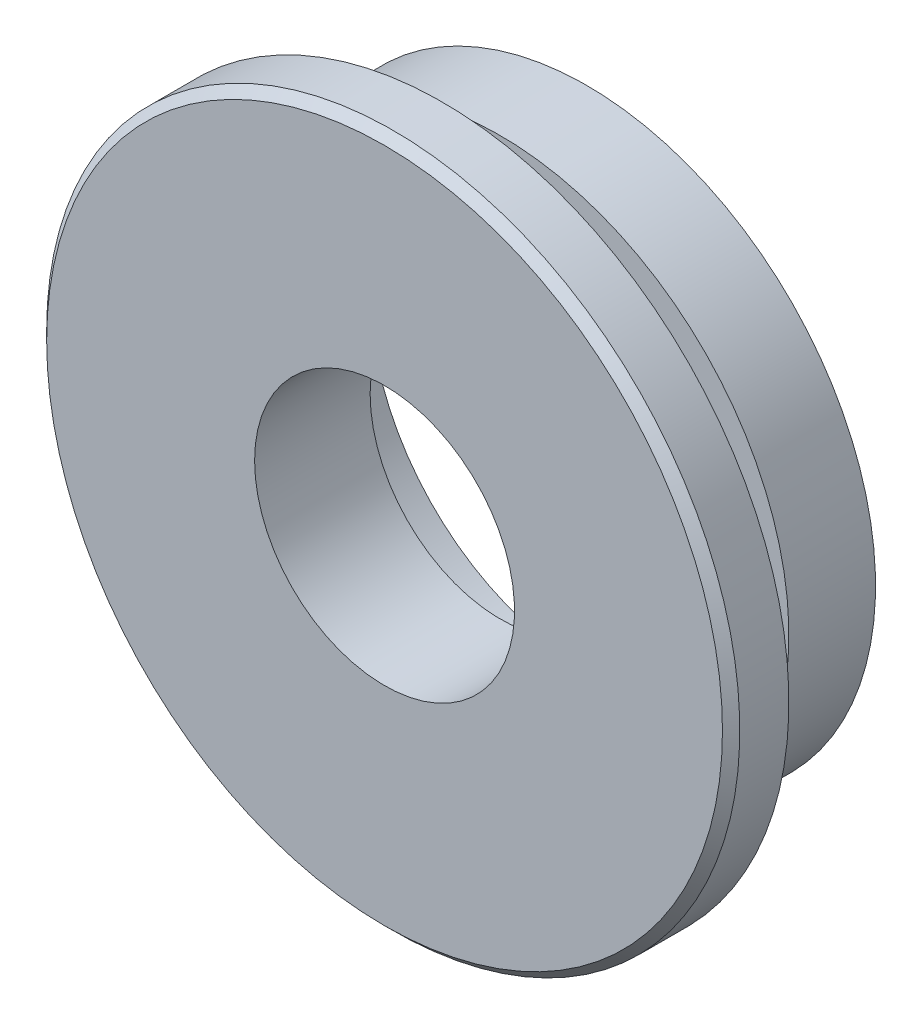
ISO-10303-21;
HEADER;
FILE_DESCRIPTION(('STEP AP214'),'2;1');
FILE_NAME('part.step','',(''),(''),'','','');
FILE_SCHEMA(('AUTOMOTIVE_DESIGN { 1 0 10303 214 1 1 1 1 }'));
ENDSEC;
DATA;
#1=APPLICATION_CONTEXT('core data for automotive mechanical design processes');
#2=APPLICATION_PROTOCOL_DEFINITION('international standard','automotive_design',2000,#1);
#3=PRODUCT_CONTEXT('',#1,'mechanical');
#4=PRODUCT('Part','Part','',(#3));
#5=PRODUCT_RELATED_PRODUCT_CATEGORY('part','',(#4));
#6=PRODUCT_DEFINITION_FORMATION('','',#4);
#7=PRODUCT_DEFINITION_CONTEXT('part definition',#1,'design');
#8=PRODUCT_DEFINITION('design','',#6,#7);
#9=PRODUCT_DEFINITION_SHAPE('','',#8);
#10=(LENGTH_UNIT() NAMED_UNIT(*) SI_UNIT(.MILLI.,.METRE.));
#11=(NAMED_UNIT(*) PLANE_ANGLE_UNIT() SI_UNIT($,.RADIAN.));
#12=(NAMED_UNIT(*) SI_UNIT($,.STERADIAN.) SOLID_ANGLE_UNIT());
#13=UNCERTAINTY_MEASURE_WITH_UNIT(LENGTH_MEASURE(1.E-05),#10,'distance_accuracy_value','');
#14=(GEOMETRIC_REPRESENTATION_CONTEXT(3) GLOBAL_UNCERTAINTY_ASSIGNED_CONTEXT((#13)) GLOBAL_UNIT_ASSIGNED_CONTEXT((#10,
#11,#12)) REPRESENTATION_CONTEXT('',''));
#15=CARTESIAN_POINT('',(0.,0.,0.));
#16=DIRECTION('',(0.,0.,1.));
#17=DIRECTION('',(1.,0.,0.));
#18=AXIS2_PLACEMENT_3D('',#15,#16,#17);
#19=CARTESIAN_POINT('',(0.,0.,-7.));
#20=DIRECTION('',(0.,0.,-1.));
#21=DIRECTION('',(-1.,0.,0.));
#22=AXIS2_PLACEMENT_3D('',#19,#20,#21);
#23=CYLINDRICAL_SURFACE('',#22,4.5);
#24=CARTESIAN_POINT('',(0.,0.,-4.));
#25=DIRECTION('',(0.,0.,-1.));
#26=DIRECTION('',(-1.,0.,0.));
#27=AXIS2_PLACEMENT_3D('',#24,#25,#26);
#28=CIRCLE('',#27,4.5);
#29=CARTESIAN_POINT('',(-4.5,0.,-4.));
#30=VERTEX_POINT('',#29);
#31=EDGE_CURVE('E10',#30,#30,#28,.T.);
#32=ORIENTED_EDGE('',*,*,#31,.T.);
#33=EDGE_LOOP('',(#32));
#34=FACE_BOUND('',#33,.T.);
#35=CARTESIAN_POINT('',(0.,0.,0.));
#36=DIRECTION('',(0.,0.,-1.));
#37=DIRECTION('',(-1.,0.,0.));
#38=AXIS2_PLACEMENT_3D('',#35,#36,#37);
#39=CIRCLE('',#38,4.5);
#40=CARTESIAN_POINT('',(-4.5,0.,0.));
#41=VERTEX_POINT('',#40);
#42=EDGE_CURVE('E68',#41,#41,#39,.T.);
#43=ORIENTED_EDGE('',*,*,#42,.F.);
#44=EDGE_LOOP('',(#43));
#45=FACE_BOUND('',#44,.T.);
#46=ADVANCED_FACE('F31',(#34,#45),#23,.F.);
#47=CARTESIAN_POINT('',(-4.5,0.,-4.));
#48=DIRECTION('',(0.,0.,-1.));
#49=DIRECTION('',(-1.,0.,0.));
#50=AXIS2_PLACEMENT_3D('',#47,#48,#49);
#51=PLANE('',#50);
#52=CARTESIAN_POINT('',(0.,0.,-4.));
#53=DIRECTION('',(0.,0.,-1.));
#54=DIRECTION('',(-1.,0.,0.));
#55=AXIS2_PLACEMENT_3D('',#52,#53,#54);
#56=CIRCLE('',#55,7.5);
#57=CARTESIAN_POINT('',(-7.5,0.,-4.));
#58=VERTEX_POINT('',#57);
#59=EDGE_CURVE('E37',#58,#58,#56,.T.);
#60=ORIENTED_EDGE('',*,*,#59,.T.);
#61=EDGE_LOOP('',(#60));
#62=FACE_BOUND('',#61,.T.);
#63=ORIENTED_EDGE('',*,*,#31,.F.);
#64=EDGE_LOOP('',(#63));
#65=FACE_BOUND('',#64,.T.);
#66=ADVANCED_FACE('F76',(#62,#65),#51,.T.);
#67=CARTESIAN_POINT('',(0.,0.,-7.));
#68=DIRECTION('',(0.,0.,-1.));
#69=DIRECTION('',(-1.,0.,0.));
#70=AXIS2_PLACEMENT_3D('',#67,#68,#69);
#71=CYLINDRICAL_SURFACE('',#70,7.5);
#72=CARTESIAN_POINT('',(0.,0.,-7.));
#73=DIRECTION('',(0.,0.,-1.));
#74=DIRECTION('',(-1.,0.,0.));
#75=AXIS2_PLACEMENT_3D('',#72,#73,#74);
#76=CIRCLE('',#75,7.5);
#77=CARTESIAN_POINT('',(-7.5,0.,-7.));
#78=VERTEX_POINT('',#77);
#79=EDGE_CURVE('E41',#78,#78,#76,.T.);
#80=ORIENTED_EDGE('',*,*,#79,.T.);
#81=EDGE_LOOP('',(#80));
#82=FACE_BOUND('',#81,.T.);
#83=ORIENTED_EDGE('',*,*,#59,.F.);
#84=EDGE_LOOP('',(#83));
#85=FACE_BOUND('',#84,.T.);
#86=ADVANCED_FACE('F80',(#82,#85),#71,.F.);
#87=CARTESIAN_POINT('',(-10.,0.,-7.));
#88=DIRECTION('',(0.,0.,-1.));
#89=DIRECTION('',(-1.,0.,0.));
#90=AXIS2_PLACEMENT_3D('',#87,#88,#89);
#91=PLANE('',#90);
#92=CARTESIAN_POINT('',(0.,0.,-7.));
#93=DIRECTION('',(0.,0.,-1.));
#94=DIRECTION('',(-1.,0.,0.));
#95=AXIS2_PLACEMENT_3D('',#92,#93,#94);
#96=CIRCLE('',#95,10.);
#97=CARTESIAN_POINT('',(-10.,0.,-7.));
#98=VERTEX_POINT('',#97);
#99=EDGE_CURVE('E45',#98,#98,#96,.T.);
#100=ORIENTED_EDGE('',*,*,#99,.T.);
#101=EDGE_LOOP('',(#100));
#102=FACE_BOUND('',#101,.T.);
#103=ORIENTED_EDGE('',*,*,#79,.F.);
#104=EDGE_LOOP('',(#103));
#105=FACE_BOUND('',#104,.T.);
#106=ADVANCED_FACE('F84',(#102,#105),#91,.T.);
#107=CARTESIAN_POINT('',(0.,0.,-7.));
#108=DIRECTION('',(0.,0.,-1.));
#109=DIRECTION('',(-1.,0.,0.));
#110=AXIS2_PLACEMENT_3D('',#107,#108,#109);
#111=CYLINDRICAL_SURFACE('',#110,10.);
#112=CARTESIAN_POINT('',(0.,0.,-4.));
#113=DIRECTION('',(0.,0.,-1.));
#114=DIRECTION('',(-1.,0.,0.));
#115=AXIS2_PLACEMENT_3D('',#112,#113,#114);
#116=CIRCLE('',#115,10.);
#117=CARTESIAN_POINT('',(-10.,0.,-4.));
#118=VERTEX_POINT('',#117);
#119=EDGE_CURVE('E50',#118,#118,#116,.T.);
#120=ORIENTED_EDGE('',*,*,#119,.T.);
#121=EDGE_LOOP('',(#120));
#122=FACE_BOUND('',#121,.T.);
#123=ORIENTED_EDGE('',*,*,#99,.F.);
#124=EDGE_LOOP('',(#123));
#125=FACE_BOUND('',#124,.T.);
#126=ADVANCED_FACE('F91',(#122,#125),#111,.T.);
#127=CARTESIAN_POINT('',(-9.,0.,-4.));
#128=DIRECTION('',(0.,0.,1.));
#129=DIRECTION('',(1.,0.,0.));
#130=AXIS2_PLACEMENT_3D('',#127,#128,#129);
#131=PLANE('',#130);
#132=CARTESIAN_POINT('',(0.,0.,-4.));
#133=DIRECTION('',(0.,0.,-1.));
#134=DIRECTION('',(-1.,0.,0.));
#135=AXIS2_PLACEMENT_3D('',#132,#133,#134);
#136=CIRCLE('',#135,9.);
#137=CARTESIAN_POINT('',(-9.,0.,-4.));
#138=VERTEX_POINT('',#137);
#139=EDGE_CURVE('E53',#138,#138,#136,.T.);
#140=ORIENTED_EDGE('',*,*,#139,.T.);
#141=EDGE_LOOP('',(#140));
#142=FACE_BOUND('',#141,.T.);
#143=ORIENTED_EDGE('',*,*,#119,.F.);
#144=EDGE_LOOP('',(#143));
#145=FACE_BOUND('',#144,.T.);
#146=ADVANCED_FACE('F95',(#142,#145),#131,.T.);
#147=CARTESIAN_POINT('',(0.,0.,-7.));
#148=DIRECTION('',(0.,0.,-1.));
#149=DIRECTION('',(-1.,0.,0.));
#150=AXIS2_PLACEMENT_3D('',#147,#148,#149);
#151=CYLINDRICAL_SURFACE('',#150,9.);
#152=CARTESIAN_POINT('',(0.,0.,-2.));
#153=DIRECTION('',(0.,0.,-1.));
#154=DIRECTION('',(-1.,0.,0.));
#155=AXIS2_PLACEMENT_3D('',#152,#153,#154);
#156=CIRCLE('',#155,9.);
#157=CARTESIAN_POINT('',(-9.,0.,-2.));
#158=VERTEX_POINT('',#157);
#159=EDGE_CURVE('E56',#158,#158,#156,.T.);
#160=ORIENTED_EDGE('',*,*,#159,.T.);
#161=EDGE_LOOP('',(#160));
#162=FACE_BOUND('',#161,.T.);
#163=ORIENTED_EDGE('',*,*,#139,.F.);
#164=EDGE_LOOP('',(#163));
#165=FACE_BOUND('',#164,.T.);
#166=ADVANCED_FACE('F99',(#162,#165),#151,.T.);
#167=CARTESIAN_POINT('',(-12.,0.,-2.));
#168=DIRECTION('',(0.,0.,-1.));
#169=DIRECTION('',(-1.,0.,0.));
#170=AXIS2_PLACEMENT_3D('',#167,#168,#169);
#171=PLANE('',#170);
#172=CARTESIAN_POINT('',(0.,0.,-2.));
#173=DIRECTION('',(0.,0.,-1.));
#174=DIRECTION('',(-1.,0.,0.));
#175=AXIS2_PLACEMENT_3D('',#172,#173,#174);
#176=CIRCLE('',#175,12.);
#177=CARTESIAN_POINT('',(-12.,0.,-2.));
#178=VERTEX_POINT('',#177);
#179=EDGE_CURVE('E59',#178,#178,#176,.T.);
#180=ORIENTED_EDGE('',*,*,#179,.T.);
#181=EDGE_LOOP('',(#180));
#182=FACE_BOUND('',#181,.T.);
#183=ORIENTED_EDGE('',*,*,#159,.F.);
#184=EDGE_LOOP('',(#183));
#185=FACE_BOUND('',#184,.T.);
#186=ADVANCED_FACE('F103',(#182,#185),#171,.T.);
#187=CARTESIAN_POINT('',(0.,0.,-7.));
#188=DIRECTION('',(0.,0.,-1.));
#189=DIRECTION('',(-1.,0.,0.));
#190=AXIS2_PLACEMENT_3D('',#187,#188,#189);
#191=CYLINDRICAL_SURFACE('',#190,12.);
#192=CARTESIAN_POINT('',(0.,0.,-0.299999999999998));
#193=DIRECTION('',(0.,0.,-1.));
#194=DIRECTION('',(-1.,0.,0.));
#195=AXIS2_PLACEMENT_3D('',#192,#193,#194);
#196=CIRCLE('',#195,12.);
#197=CARTESIAN_POINT('',(-12.,0.,-0.299999999999998));
#198=VERTEX_POINT('',#197);
#199=EDGE_CURVE('E62',#198,#198,#196,.T.);
#200=ORIENTED_EDGE('',*,*,#199,.T.);
#201=EDGE_LOOP('',(#200));
#202=FACE_BOUND('',#201,.T.);
#203=ORIENTED_EDGE('',*,*,#179,.F.);
#204=EDGE_LOOP('',(#203));
#205=FACE_BOUND('',#204,.T.);
#206=ADVANCED_FACE('F107',(#202,#205),#191,.T.);
#207=CARTESIAN_POINT('',(0.,0.,-0.299999999999998));
#208=DIRECTION('',(0.,0.,-1.));
#209=DIRECTION('',(-1.,0.,0.));
#210=AXIS2_PLACEMENT_3D('',#207,#208,#209);
#211=CONICAL_SURFACE('',#210,12.,0.785398163397448);
#212=CARTESIAN_POINT('',(0.,0.,0.));
#213=DIRECTION('',(0.,0.,-1.));
#214=DIRECTION('',(-1.,0.,0.));
#215=AXIS2_PLACEMENT_3D('',#212,#213,#214);
#216=CIRCLE('',#215,11.7);
#217=CARTESIAN_POINT('',(-11.7,0.,0.));
#218=VERTEX_POINT('',#217);
#219=EDGE_CURVE('E65',#218,#218,#216,.T.);
#220=ORIENTED_EDGE('',*,*,#219,.T.);
#221=EDGE_LOOP('',(#220));
#222=FACE_BOUND('',#221,.T.);
#223=ORIENTED_EDGE('',*,*,#199,.F.);
#224=EDGE_LOOP('',(#223));
#225=FACE_BOUND('',#224,.T.);
#226=ADVANCED_FACE('F111',(#222,#225),#211,.T.);
#227=CARTESIAN_POINT('',(-4.5,0.,0.));
#228=DIRECTION('',(0.,0.,1.));
#229=DIRECTION('',(1.,0.,0.));
#230=AXIS2_PLACEMENT_3D('',#227,#228,#229);
#231=PLANE('',#230);
#232=ORIENTED_EDGE('',*,*,#42,.T.);
#233=EDGE_LOOP('',(#232));
#234=FACE_BOUND('',#233,.T.);
#235=ORIENTED_EDGE('',*,*,#219,.F.);
#236=EDGE_LOOP('',(#235));
#237=FACE_BOUND('',#236,.T.);
#238=ADVANCED_FACE('F72',(#234,#237),#231,.T.);
#239=CLOSED_SHELL('',(#46,#66,#86,#106,#126,#146,#166,#186,#206,#226,#238));
#240=MANIFOLD_SOLID_BREP('B2',#239);
#241=ADVANCED_BREP_SHAPE_REPRESENTATION('',(#18,#240),#14);
#242=SHAPE_DEFINITION_REPRESENTATION(#9,#241);
ENDSEC;
END-ISO-10303-21;
